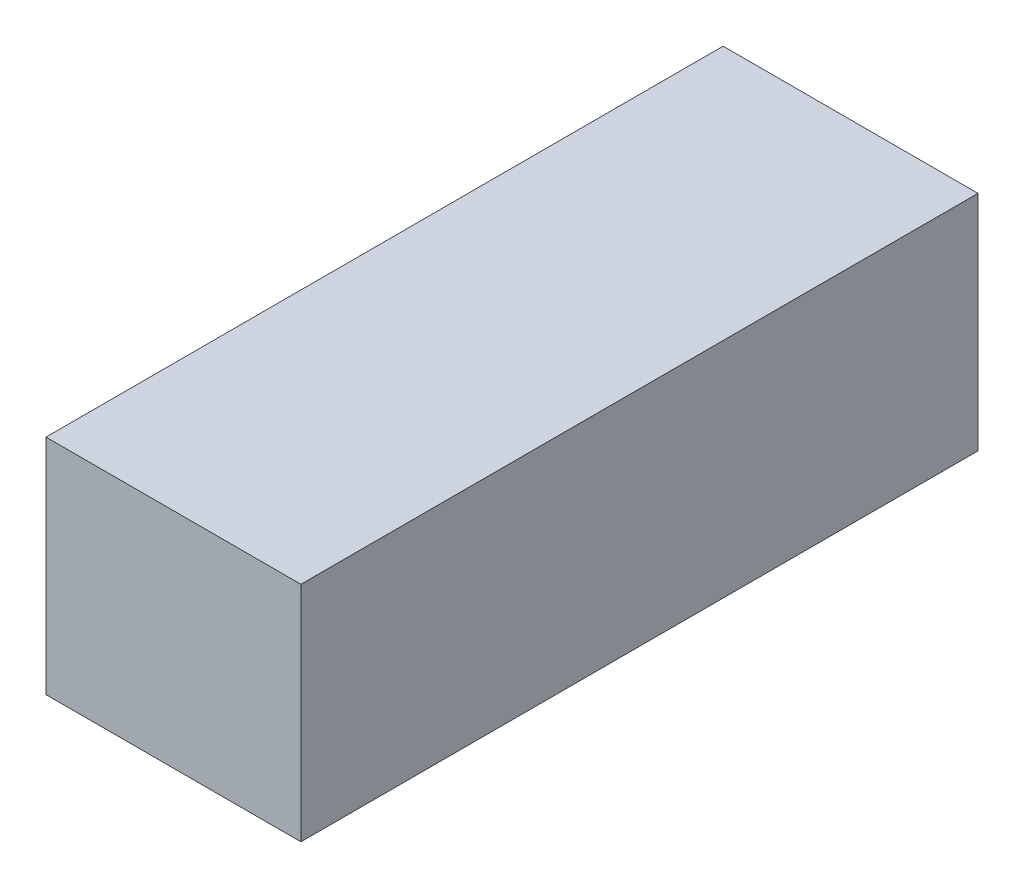
ISO-10303-21;
HEADER;
FILE_DESCRIPTION(('STEP AP214'),'2;1');
FILE_NAME('part.step','',(''),(''),'','','');
FILE_SCHEMA(('AUTOMOTIVE_DESIGN { 1 0 10303 214 1 1 1 1 }'));
ENDSEC;
DATA;
#1=APPLICATION_CONTEXT('core data for automotive mechanical design processes');
#2=APPLICATION_PROTOCOL_DEFINITION('international standard','automotive_design',2000,#1);
#3=PRODUCT_CONTEXT('',#1,'mechanical');
#4=PRODUCT('Part','Part','',(#3));
#5=PRODUCT_RELATED_PRODUCT_CATEGORY('part','',(#4));
#6=PRODUCT_DEFINITION_FORMATION('','',#4);
#7=PRODUCT_DEFINITION_CONTEXT('part definition',#1,'design');
#8=PRODUCT_DEFINITION('design','',#6,#7);
#9=PRODUCT_DEFINITION_SHAPE('','',#8);
#10=(LENGTH_UNIT() NAMED_UNIT(*) SI_UNIT(.MILLI.,.METRE.));
#11=(NAMED_UNIT(*) PLANE_ANGLE_UNIT() SI_UNIT($,.RADIAN.));
#12=(NAMED_UNIT(*) SI_UNIT($,.STERADIAN.) SOLID_ANGLE_UNIT());
#13=UNCERTAINTY_MEASURE_WITH_UNIT(LENGTH_MEASURE(1.E-05),#10,'distance_accuracy_value','');
#14=(GEOMETRIC_REPRESENTATION_CONTEXT(3) GLOBAL_UNCERTAINTY_ASSIGNED_CONTEXT((#13)) GLOBAL_UNIT_ASSIGNED_CONTEXT((#10,
#11,#12)) REPRESENTATION_CONTEXT('',''));
#15=CARTESIAN_POINT('',(0.,0.,0.));
#16=DIRECTION('',(0.,0.,1.));
#17=DIRECTION('',(1.,0.,0.));
#18=AXIS2_PLACEMENT_3D('',#15,#16,#17);
#19=CARTESIAN_POINT('',(0.,0.,134.9375));
#20=DIRECTION('',(1.,0.,0.));
#21=DIRECTION('',(0.,0.,-1.));
#22=AXIS2_PLACEMENT_3D('',#19,#20,#21);
#23=PLANE('',#22);
#24=DIRECTION('',(0.,-1.,0.));
#25=VECTOR('',#24,1.);
#26=CARTESIAN_POINT('',(0.,0.,0.));
#27=LINE('',#26,#25);
#28=CARTESIAN_POINT('',(0.,44.45,0.));
#29=VERTEX_POINT('',#28);
#30=CARTESIAN_POINT('',(0.,0.,0.));
#31=VERTEX_POINT('',#30);
#32=EDGE_CURVE('E107',#29,#31,#27,.T.);
#33=ORIENTED_EDGE('',*,*,#32,.T.);
#34=DIRECTION('',(0.,0.,-1.));
#35=VECTOR('',#34,1.);
#36=CARTESIAN_POINT('',(0.,0.,134.9375));
#37=LINE('',#36,#35);
#38=CARTESIAN_POINT('',(0.,0.,134.9375));
#39=VERTEX_POINT('',#38);
#40=EDGE_CURVE('E11',#39,#31,#37,.T.);
#41=ORIENTED_EDGE('',*,*,#40,.F.);
#42=DIRECTION('',(0.,-1.,0.));
#43=VECTOR('',#42,1.);
#44=CARTESIAN_POINT('',(0.,0.,134.9375));
#45=LINE('',#44,#43);
#46=CARTESIAN_POINT('',(0.,44.45,134.9375));
#47=VERTEX_POINT('',#46);
#48=EDGE_CURVE('E91',#47,#39,#45,.T.);
#49=ORIENTED_EDGE('',*,*,#48,.F.);
#50=DIRECTION('',(0.,0.,-1.));
#51=VECTOR('',#50,1.);
#52=CARTESIAN_POINT('',(0.,44.45,134.9375));
#53=LINE('',#52,#51);
#54=EDGE_CURVE('E103',#47,#29,#53,.T.);
#55=ORIENTED_EDGE('',*,*,#54,.T.);
#56=EDGE_LOOP('',(#33,#41,#49,#55));
#57=FACE_BOUND('',#56,.T.);
#58=ADVANCED_FACE('F39',(#57),#23,.F.);
#59=CARTESIAN_POINT('',(0.,0.,134.9375));
#60=DIRECTION('',(0.,1.,0.));
#61=DIRECTION('',(0.,0.,1.));
#62=AXIS2_PLACEMENT_3D('',#59,#60,#61);
#63=PLANE('',#62);
#64=DIRECTION('',(1.,0.,0.));
#65=VECTOR('',#64,1.);
#66=CARTESIAN_POINT('',(0.,0.,0.));
#67=LINE('',#66,#65);
#68=CARTESIAN_POINT('',(50.8,0.,0.));
#69=VERTEX_POINT('',#68);
#70=EDGE_CURVE('E96',#31,#69,#67,.T.);
#71=ORIENTED_EDGE('',*,*,#70,.T.);
#72=DIRECTION('',(0.,0.,-1.));
#73=VECTOR('',#72,1.);
#74=CARTESIAN_POINT('',(50.8,0.,134.9375));
#75=LINE('',#74,#73);
#76=CARTESIAN_POINT('',(50.8,0.,134.9375));
#77=VERTEX_POINT('',#76);
#78=EDGE_CURVE('E48',#77,#69,#75,.T.);
#79=ORIENTED_EDGE('',*,*,#78,.F.);
#80=DIRECTION('',(1.,0.,0.));
#81=VECTOR('',#80,1.);
#82=CARTESIAN_POINT('',(0.,0.,134.9375));
#83=LINE('',#82,#81);
#84=EDGE_CURVE('E86',#39,#77,#83,.T.);
#85=ORIENTED_EDGE('',*,*,#84,.F.);
#86=ORIENTED_EDGE('',*,*,#40,.T.);
#87=EDGE_LOOP('',(#71,#79,#85,#86));
#88=FACE_BOUND('',#87,.T.);
#89=ADVANCED_FACE('F95',(#88),#63,.F.);
#90=CARTESIAN_POINT('',(50.8,0.,134.9375));
#91=DIRECTION('',(-1.,0.,0.));
#92=DIRECTION('',(0.,0.,1.));
#93=AXIS2_PLACEMENT_3D('',#90,#91,#92);
#94=PLANE('',#93);
#95=DIRECTION('',(0.,1.,0.));
#96=VECTOR('',#95,1.);
#97=CARTESIAN_POINT('',(50.8,0.,0.));
#98=LINE('',#97,#96);
#99=CARTESIAN_POINT('',(50.8,44.45,0.));
#100=VERTEX_POINT('',#99);
#101=EDGE_CURVE('E73',#69,#100,#98,.T.);
#102=ORIENTED_EDGE('',*,*,#101,.T.);
#103=DIRECTION('',(0.,0.,-1.));
#104=VECTOR('',#103,1.);
#105=CARTESIAN_POINT('',(50.8,44.45,134.9375));
#106=LINE('',#105,#104);
#107=CARTESIAN_POINT('',(50.8,44.45,134.9375));
#108=VERTEX_POINT('',#107);
#109=EDGE_CURVE('E98',#108,#100,#106,.T.);
#110=ORIENTED_EDGE('',*,*,#109,.F.);
#111=DIRECTION('',(0.,1.,0.));
#112=VECTOR('',#111,1.);
#113=CARTESIAN_POINT('',(50.8,0.,134.9375));
#114=LINE('',#113,#112);
#115=EDGE_CURVE('E89',#77,#108,#114,.T.);
#116=ORIENTED_EDGE('',*,*,#115,.F.);
#117=ORIENTED_EDGE('',*,*,#78,.T.);
#118=EDGE_LOOP('',(#102,#110,#116,#117));
#119=FACE_BOUND('',#118,.T.);
#120=ADVANCED_FACE('F99',(#119),#94,.F.);
#121=CARTESIAN_POINT('',(0.,44.45,134.9375));
#122=DIRECTION('',(0.,-1.,0.));
#123=DIRECTION('',(0.,0.,-1.));
#124=AXIS2_PLACEMENT_3D('',#121,#122,#123);
#125=PLANE('',#124);
#126=DIRECTION('',(-1.,0.,0.));
#127=VECTOR('',#126,1.);
#128=CARTESIAN_POINT('',(0.,44.45,0.));
#129=LINE('',#128,#127);
#130=EDGE_CURVE('E79',#100,#29,#129,.T.);
#131=ORIENTED_EDGE('',*,*,#130,.T.);
#132=ORIENTED_EDGE('',*,*,#54,.F.);
#133=DIRECTION('',(-1.,0.,0.));
#134=VECTOR('',#133,1.);
#135=CARTESIAN_POINT('',(0.,44.45,134.9375));
#136=LINE('',#135,#134);
#137=EDGE_CURVE('E56',#108,#47,#136,.T.);
#138=ORIENTED_EDGE('',*,*,#137,.F.);
#139=ORIENTED_EDGE('',*,*,#109,.T.);
#140=EDGE_LOOP('',(#131,#132,#138,#139));
#141=FACE_BOUND('',#140,.T.);
#142=ADVANCED_FACE('F120',(#141),#125,.F.);
#143=CARTESIAN_POINT('',(0.,0.,134.9375));
#144=DIRECTION('',(0.,0.,-1.));
#145=DIRECTION('',(-1.,0.,0.));
#146=AXIS2_PLACEMENT_3D('',#143,#144,#145);
#147=PLANE('',#146);
#148=ORIENTED_EDGE('',*,*,#48,.T.);
#149=ORIENTED_EDGE('',*,*,#84,.T.);
#150=ORIENTED_EDGE('',*,*,#115,.T.);
#151=ORIENTED_EDGE('',*,*,#137,.T.);
#152=EDGE_LOOP('',(#148,#149,#150,#151));
#153=FACE_BOUND('',#152,.T.);
#154=ADVANCED_FACE('F87',(#153),#147,.F.);
#155=CARTESIAN_POINT('',(0.,0.,0.));
#156=DIRECTION('',(0.,0.,-1.));
#157=DIRECTION('',(-1.,0.,0.));
#158=AXIS2_PLACEMENT_3D('',#155,#156,#157);
#159=PLANE('',#158);
#160=ORIENTED_EDGE('',*,*,#32,.F.);
#161=ORIENTED_EDGE('',*,*,#130,.F.);
#162=ORIENTED_EDGE('',*,*,#101,.F.);
#163=ORIENTED_EDGE('',*,*,#70,.F.);
#164=EDGE_LOOP('',(#160,#161,#162,#163));
#165=FACE_BOUND('',#164,.T.);
#166=ADVANCED_FACE('F123',(#165),#159,.T.);
#167=CLOSED_SHELL('',(#58,#89,#120,#142,#154,#166));
#168=MANIFOLD_SOLID_BREP('B2',#167);
#169=ADVANCED_BREP_SHAPE_REPRESENTATION('',(#18,#168),#14);
#170=SHAPE_DEFINITION_REPRESENTATION(#9,#169);
ENDSEC;
END-ISO-10303-21;
